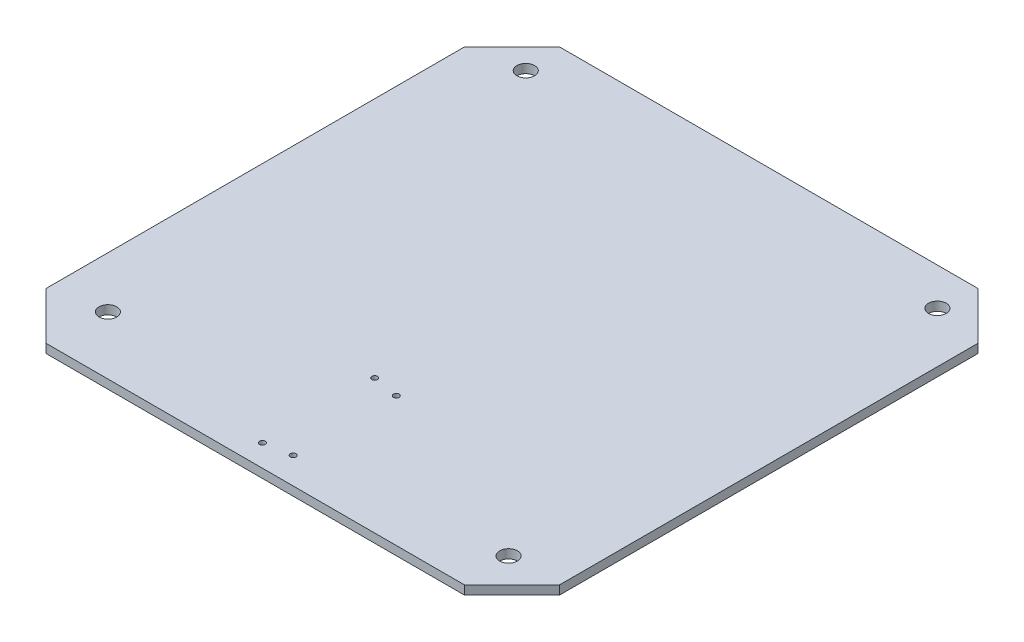
ISO-10303-21;
HEADER;
FILE_DESCRIPTION(('STEP AP214'),'2;1');
FILE_NAME('part.step','',(''),(''),'','','');
FILE_SCHEMA(('AUTOMOTIVE_DESIGN { 1 0 10303 214 1 1 1 1 }'));
ENDSEC;
DATA;
#1=APPLICATION_CONTEXT('core data for automotive mechanical design processes');
#2=APPLICATION_PROTOCOL_DEFINITION('international standard','automotive_design',2000,#1);
#3=PRODUCT_CONTEXT('',#1,'mechanical');
#4=PRODUCT('Part','Part','',(#3));
#5=PRODUCT_RELATED_PRODUCT_CATEGORY('part','',(#4));
#6=PRODUCT_DEFINITION_FORMATION('','',#4);
#7=PRODUCT_DEFINITION_CONTEXT('part definition',#1,'design');
#8=PRODUCT_DEFINITION('design','',#6,#7);
#9=PRODUCT_DEFINITION_SHAPE('','',#8);
#10=(LENGTH_UNIT() NAMED_UNIT(*) SI_UNIT(.MILLI.,.METRE.));
#11=(NAMED_UNIT(*) PLANE_ANGLE_UNIT() SI_UNIT($,.RADIAN.));
#12=(NAMED_UNIT(*) SI_UNIT($,.STERADIAN.) SOLID_ANGLE_UNIT());
#13=UNCERTAINTY_MEASURE_WITH_UNIT(LENGTH_MEASURE(1.E-05),#10,'distance_accuracy_value','');
#14=(GEOMETRIC_REPRESENTATION_CONTEXT(3) GLOBAL_UNCERTAINTY_ASSIGNED_CONTEXT((#13)) GLOBAL_UNIT_ASSIGNED_CONTEXT((#10,
#11,#12)) REPRESENTATION_CONTEXT('',''));
#15=CARTESIAN_POINT('',(0.,0.,0.));
#16=DIRECTION('',(0.,0.,1.));
#17=DIRECTION('',(1.,0.,0.));
#18=AXIS2_PLACEMENT_3D('',#15,#16,#17);
#19=CARTESIAN_POINT('',(0.,1.59,0.));
#20=DIRECTION('',(0.,-1.,0.));
#21=DIRECTION('',(0.,0.,-1.));
#22=AXIS2_PLACEMENT_3D('',#19,#20,#21);
#23=PLANE('',#22);
#24=CARTESIAN_POINT('',(-36.8206115379805,1.59,35.5891529581149));
#25=DIRECTION('',(0.,1.,0.));
#26=DIRECTION('',(0.,0.,1.));
#27=AXIS2_PLACEMENT_3D('',#24,#25,#26);
#28=CIRCLE('',#27,1.58999999999999);
#29=CARTESIAN_POINT('',(-36.8206115379805,1.59,37.1791529581149));
#30=VERTEX_POINT('',#29);
#31=EDGE_CURVE('E228',#30,#30,#28,.T.);
#32=ORIENTED_EDGE('',*,*,#31,.F.);
#33=EDGE_LOOP('',(#32));
#34=FACE_BOUND('',#33,.T.);
#35=CARTESIAN_POINT('',(36.9437573959671,1.59,-39.2835286977116));
#36=DIRECTION('',(0.,1.,0.));
#37=DIRECTION('',(0.,0.,1.));
#38=AXIS2_PLACEMENT_3D('',#35,#36,#37);
#39=CIRCLE('',#38,1.58999999999999);
#40=CARTESIAN_POINT('',(36.9437573959671,1.59,-37.6935286977116));
#41=VERTEX_POINT('',#40);
#42=EDGE_CURVE('E216',#41,#41,#39,.T.);
#43=ORIENTED_EDGE('',*,*,#42,.F.);
#44=EDGE_LOOP('',(#43));
#45=FACE_BOUND('',#44,.T.);
#46=DIRECTION('',(0.,0.,-1.));
#47=VECTOR('',#46,1.);
#48=CARTESIAN_POINT('',(46.,1.59,46.));
#49=LINE('',#48,#47);
#50=CARTESIAN_POINT('',(46.,1.59,37.5));
#51=VERTEX_POINT('',#50);
#52=CARTESIAN_POINT('',(46.,1.59,-37.4999999999999));
#53=VERTEX_POINT('',#52);
#54=EDGE_CURVE('E144',#51,#53,#49,.T.);
#55=ORIENTED_EDGE('',*,*,#54,.T.);
#56=DIRECTION('',(0.707106781186546,0.,0.707106781186549));
#57=VECTOR('',#56,1.);
#58=CARTESIAN_POINT('',(37.5,1.59,-46.));
#59=LINE('',#58,#57);
#60=CARTESIAN_POINT('',(37.5,1.59,-46.));
#61=VERTEX_POINT('',#60);
#62=EDGE_CURVE('E159',#53,#61,#59,.F.);
#63=ORIENTED_EDGE('',*,*,#62,.T.);
#64=DIRECTION('',(-1.,0.,0.));
#65=VECTOR('',#64,1.);
#66=CARTESIAN_POINT('',(-46.,1.59,-46.));
#67=LINE('',#66,#65);
#68=CARTESIAN_POINT('',(-37.5,1.59,-46.));
#69=VERTEX_POINT('',#68);
#70=EDGE_CURVE('E126',#61,#69,#67,.T.);
#71=ORIENTED_EDGE('',*,*,#70,.T.);
#72=DIRECTION('',(0.707106781186548,0.,-0.707106781186547));
#73=VECTOR('',#72,1.);
#74=CARTESIAN_POINT('',(-46.,1.59,-37.5));
#75=LINE('',#74,#73);
#76=CARTESIAN_POINT('',(-46.,1.59,-37.5));
#77=VERTEX_POINT('',#76);
#78=EDGE_CURVE('E157',#69,#77,#75,.F.);
#79=ORIENTED_EDGE('',*,*,#78,.T.);
#80=DIRECTION('',(0.,0.,1.));
#81=VECTOR('',#80,1.);
#82=CARTESIAN_POINT('',(-46.,1.59,46.));
#83=LINE('',#82,#81);
#84=CARTESIAN_POINT('',(-46.,1.59,37.5));
#85=VERTEX_POINT('',#84);
#86=EDGE_CURVE('E170',#77,#85,#83,.T.);
#87=ORIENTED_EDGE('',*,*,#86,.T.);
#88=DIRECTION('',(-0.707106781186546,0.,-0.707106781186549));
#89=VECTOR('',#88,1.);
#90=CARTESIAN_POINT('',(-37.5,1.59,46.));
#91=LINE('',#90,#89);
#92=CARTESIAN_POINT('',(-37.5,1.59,46.));
#93=VERTEX_POINT('',#92);
#94=EDGE_CURVE('E61',#85,#93,#91,.F.);
#95=ORIENTED_EDGE('',*,*,#94,.T.);
#96=DIRECTION('',(1.,0.,0.));
#97=VECTOR('',#96,1.);
#98=CARTESIAN_POINT('',(-46.,1.59,46.));
#99=LINE('',#98,#97);
#100=CARTESIAN_POINT('',(37.5,1.59,46.));
#101=VERTEX_POINT('',#100);
#102=EDGE_CURVE('E145',#93,#101,#99,.T.);
#103=ORIENTED_EDGE('',*,*,#102,.T.);
#104=DIRECTION('',(-0.707106781186549,0.,0.707106781186546));
#105=VECTOR('',#104,1.);
#106=CARTESIAN_POINT('',(46.,1.59,37.5));
#107=LINE('',#106,#105);
#108=EDGE_CURVE('E154',#101,#51,#107,.F.);
#109=ORIENTED_EDGE('',*,*,#108,.T.);
#110=EDGE_LOOP('',(#55,#63,#71,#79,#87,#95,#103,#109));
#111=FACE_BOUND('',#110,.T.);
#112=CARTESIAN_POINT('',(-2.67000000000001,1.59,21.93));
#113=DIRECTION('',(0.,1.,0.));
#114=DIRECTION('',(0.,0.,1.));
#115=AXIS2_PLACEMENT_3D('',#112,#113,#114);
#116=CIRCLE('',#115,0.509999999999999);
#117=CARTESIAN_POINT('',(-2.67000000000001,1.59,22.44));
#118=VERTEX_POINT('',#117);
#119=EDGE_CURVE('E139',#118,#118,#116,.T.);
#120=ORIENTED_EDGE('',*,*,#119,.F.);
#121=EDGE_LOOP('',(#120));
#122=FACE_BOUND('',#121,.T.);
#123=CARTESIAN_POINT('',(2.02999999999999,1.59,22.76));
#124=DIRECTION('',(0.,1.,0.));
#125=DIRECTION('',(0.,0.,1.));
#126=AXIS2_PLACEMENT_3D('',#123,#124,#125);
#127=CIRCLE('',#126,0.51);
#128=CARTESIAN_POINT('',(2.02999999999999,1.59,23.27));
#129=VERTEX_POINT('',#128);
#130=EDGE_CURVE('E187',#129,#129,#127,.T.);
#131=ORIENTED_EDGE('',*,*,#130,.F.);
#132=EDGE_LOOP('',(#131));
#133=FACE_BOUND('',#132,.T.);
#134=CARTESIAN_POINT('',(-2.67000000000001,1.59,42.06));
#135=DIRECTION('',(0.,1.,0.));
#136=DIRECTION('',(0.,0.,1.));
#137=AXIS2_PLACEMENT_3D('',#134,#135,#136);
#138=CIRCLE('',#137,0.510000000000002);
#139=CARTESIAN_POINT('',(-2.67000000000001,1.59,42.57));
#140=VERTEX_POINT('',#139);
#141=EDGE_CURVE('E193',#140,#140,#138,.T.);
#142=ORIENTED_EDGE('',*,*,#141,.F.);
#143=EDGE_LOOP('',(#142));
#144=FACE_BOUND('',#143,.T.);
#145=CARTESIAN_POINT('',(2.02999999999999,1.59,41.24));
#146=DIRECTION('',(0.,1.,0.));
#147=DIRECTION('',(0.,0.,1.));
#148=AXIS2_PLACEMENT_3D('',#145,#146,#147);
#149=CIRCLE('',#148,0.510000000000002);
#150=CARTESIAN_POINT('',(2.02999999999999,1.59,41.75));
#151=VERTEX_POINT('',#150);
#152=EDGE_CURVE('E199',#151,#151,#149,.T.);
#153=ORIENTED_EDGE('',*,*,#152,.F.);
#154=EDGE_LOOP('',(#153));
#155=FACE_BOUND('',#154,.T.);
#156=CARTESIAN_POINT('',(-36.8206115379805,1.59,-39.2835286977116));
#157=DIRECTION('',(0.,1.,0.));
#158=DIRECTION('',(0.,0.,1.));
#159=AXIS2_PLACEMENT_3D('',#156,#157,#158);
#160=CIRCLE('',#159,1.58999999999999);
#161=CARTESIAN_POINT('',(-36.8206115379805,1.59,-37.6935286977116));
#162=VERTEX_POINT('',#161);
#163=EDGE_CURVE('E210',#162,#162,#160,.T.);
#164=ORIENTED_EDGE('',*,*,#163,.F.);
#165=EDGE_LOOP('',(#164));
#166=FACE_BOUND('',#165,.T.);
#167=CARTESIAN_POINT('',(36.9437573959671,1.59,37.5594866858998));
#168=DIRECTION('',(0.,1.,0.));
#169=DIRECTION('',(0.,0.,1.));
#170=AXIS2_PLACEMENT_3D('',#167,#168,#169);
#171=CIRCLE('',#170,1.58999999999999);
#172=CARTESIAN_POINT('',(36.9437573959671,1.59,39.1494866858998));
#173=VERTEX_POINT('',#172);
#174=EDGE_CURVE('E222',#173,#173,#171,.T.);
#175=ORIENTED_EDGE('',*,*,#174,.F.);
#176=EDGE_LOOP('',(#175));
#177=FACE_BOUND('',#176,.T.);
#178=ADVANCED_FACE('F39',(#34,#45,#111,#122,#133,#144,#155,#166,#177),#23,.F.);
#179=CARTESIAN_POINT('',(0.,0.,0.));
#180=DIRECTION('',(0.,-1.,0.));
#181=DIRECTION('',(0.,0.,-1.));
#182=AXIS2_PLACEMENT_3D('',#179,#180,#181);
#183=PLANE('',#182);
#184=CARTESIAN_POINT('',(-36.8206115379805,0.,35.5891529581149));
#185=DIRECTION('',(0.,-1.,0.));
#186=DIRECTION('',(0.,0.,-1.));
#187=AXIS2_PLACEMENT_3D('',#184,#185,#186);
#188=CIRCLE('',#187,1.58999999999999);
#189=CARTESIAN_POINT('',(-36.8206115379805,0.,33.9991529581149));
#190=VERTEX_POINT('',#189);
#191=EDGE_CURVE('E225',#190,#190,#188,.T.);
#192=ORIENTED_EDGE('',*,*,#191,.F.);
#193=EDGE_LOOP('',(#192));
#194=FACE_BOUND('',#193,.T.);
#195=CARTESIAN_POINT('',(36.9437573959671,0.,37.5594866858998));
#196=DIRECTION('',(0.,-1.,0.));
#197=DIRECTION('',(0.,0.,-1.));
#198=AXIS2_PLACEMENT_3D('',#195,#196,#197);
#199=CIRCLE('',#198,1.58999999999999);
#200=CARTESIAN_POINT('',(36.9437573959671,0.,35.9694866858998));
#201=VERTEX_POINT('',#200);
#202=EDGE_CURVE('E219',#201,#201,#199,.T.);
#203=ORIENTED_EDGE('',*,*,#202,.F.);
#204=EDGE_LOOP('',(#203));
#205=FACE_BOUND('',#204,.T.);
#206=CARTESIAN_POINT('',(36.9437573959671,0.,-39.2835286977116));
#207=DIRECTION('',(0.,-1.,0.));
#208=DIRECTION('',(0.,0.,-1.));
#209=AXIS2_PLACEMENT_3D('',#206,#207,#208);
#210=CIRCLE('',#209,1.58999999999999);
#211=CARTESIAN_POINT('',(36.9437573959671,0.,-40.8735286977116));
#212=VERTEX_POINT('',#211);
#213=EDGE_CURVE('E213',#212,#212,#210,.T.);
#214=ORIENTED_EDGE('',*,*,#213,.F.);
#215=EDGE_LOOP('',(#214));
#216=FACE_BOUND('',#215,.T.);
#217=CARTESIAN_POINT('',(-36.8206115379805,0.,-39.2835286977116));
#218=DIRECTION('',(0.,-1.,0.));
#219=DIRECTION('',(0.,0.,-1.));
#220=AXIS2_PLACEMENT_3D('',#217,#218,#219);
#221=CIRCLE('',#220,1.58999999999999);
#222=CARTESIAN_POINT('',(-36.8206115379805,0.,-40.8735286977116));
#223=VERTEX_POINT('',#222);
#224=EDGE_CURVE('E205',#223,#223,#221,.T.);
#225=ORIENTED_EDGE('',*,*,#224,.F.);
#226=EDGE_LOOP('',(#225));
#227=FACE_BOUND('',#226,.T.);
#228=CARTESIAN_POINT('',(-2.67000000000001,0.,42.06));
#229=DIRECTION('',(0.,1.,0.));
#230=DIRECTION('',(0.,0.,1.));
#231=AXIS2_PLACEMENT_3D('',#228,#229,#230);
#232=CIRCLE('',#231,0.510000000000002);
#233=CARTESIAN_POINT('',(-2.67000000000001,0.,42.57));
#234=VERTEX_POINT('',#233);
#235=EDGE_CURVE('E196',#234,#234,#232,.T.);
#236=ORIENTED_EDGE('',*,*,#235,.T.);
#237=EDGE_LOOP('',(#236));
#238=FACE_BOUND('',#237,.T.);
#239=CARTESIAN_POINT('',(-2.67000000000001,0.,21.93));
#240=DIRECTION('',(0.,1.,0.));
#241=DIRECTION('',(0.,0.,1.));
#242=AXIS2_PLACEMENT_3D('',#239,#240,#241);
#243=CIRCLE('',#242,0.509999999999999);
#244=CARTESIAN_POINT('',(-2.67000000000001,0.,22.44));
#245=VERTEX_POINT('',#244);
#246=EDGE_CURVE('E184',#245,#245,#243,.T.);
#247=ORIENTED_EDGE('',*,*,#246,.T.);
#248=EDGE_LOOP('',(#247));
#249=FACE_BOUND('',#248,.T.);
#250=DIRECTION('',(-1.,0.,0.));
#251=VECTOR('',#250,1.);
#252=CARTESIAN_POINT('',(-46.,0.,-46.));
#253=LINE('',#252,#251);
#254=CARTESIAN_POINT('',(37.5,0.,-46.));
#255=VERTEX_POINT('',#254);
#256=CARTESIAN_POINT('',(-37.5,0.,-46.));
#257=VERTEX_POINT('',#256);
#258=EDGE_CURVE('E123',#255,#257,#253,.T.);
#259=ORIENTED_EDGE('',*,*,#258,.F.);
#260=DIRECTION('',(-0.707106781186546,0.,-0.707106781186549));
#261=VECTOR('',#260,1.);
#262=CARTESIAN_POINT('',(41.75,0.,-41.7499999999999));
#263=LINE('',#262,#261);
#264=CARTESIAN_POINT('',(46.,0.,-37.4999999999999));
#265=VERTEX_POINT('',#264);
#266=EDGE_CURVE('E106',#255,#265,#263,.F.);
#267=ORIENTED_EDGE('',*,*,#266,.T.);
#268=DIRECTION('',(0.,0.,-1.));
#269=VECTOR('',#268,1.);
#270=CARTESIAN_POINT('',(46.,0.,46.));
#271=LINE('',#270,#269);
#272=CARTESIAN_POINT('',(46.,0.,37.5));
#273=VERTEX_POINT('',#272);
#274=EDGE_CURVE('E134',#273,#265,#271,.T.);
#275=ORIENTED_EDGE('',*,*,#274,.F.);
#276=DIRECTION('',(0.707106781186549,0.,-0.707106781186546));
#277=VECTOR('',#276,1.);
#278=CARTESIAN_POINT('',(41.7499999999999,0.,41.7500000000001));
#279=LINE('',#278,#277);
#280=CARTESIAN_POINT('',(37.5,0.,46.));
#281=VERTEX_POINT('',#280);
#282=EDGE_CURVE('E127',#273,#281,#279,.F.);
#283=ORIENTED_EDGE('',*,*,#282,.T.);
#284=DIRECTION('',(1.,0.,0.));
#285=VECTOR('',#284,1.);
#286=CARTESIAN_POINT('',(-46.,0.,46.));
#287=LINE('',#286,#285);
#288=CARTESIAN_POINT('',(-37.5,0.,46.));
#289=VERTEX_POINT('',#288);
#290=EDGE_CURVE('E137',#289,#281,#287,.T.);
#291=ORIENTED_EDGE('',*,*,#290,.F.);
#292=DIRECTION('',(0.707106781186546,0.,0.707106781186549));
#293=VECTOR('',#292,1.);
#294=CARTESIAN_POINT('',(-41.7500000000001,0.,41.7499999999999));
#295=LINE('',#294,#293);
#296=CARTESIAN_POINT('',(-46.,0.,37.5));
#297=VERTEX_POINT('',#296);
#298=EDGE_CURVE('E148',#289,#297,#295,.F.);
#299=ORIENTED_EDGE('',*,*,#298,.T.);
#300=DIRECTION('',(0.,0.,1.));
#301=VECTOR('',#300,1.);
#302=CARTESIAN_POINT('',(-46.,0.,46.));
#303=LINE('',#302,#301);
#304=CARTESIAN_POINT('',(-46.,0.,-37.5));
#305=VERTEX_POINT('',#304);
#306=EDGE_CURVE('E133',#305,#297,#303,.T.);
#307=ORIENTED_EDGE('',*,*,#306,.F.);
#308=DIRECTION('',(-0.707106781186548,0.,0.707106781186547));
#309=VECTOR('',#308,1.);
#310=CARTESIAN_POINT('',(-41.75,0.,-41.75));
#311=LINE('',#310,#309);
#312=EDGE_CURVE('E117',#305,#257,#311,.F.);
#313=ORIENTED_EDGE('',*,*,#312,.T.);
#314=EDGE_LOOP('',(#259,#267,#275,#283,#291,#299,#307,#313));
#315=FACE_BOUND('',#314,.T.);
#316=CARTESIAN_POINT('',(2.02999999999999,0.,22.76));
#317=DIRECTION('',(0.,1.,0.));
#318=DIRECTION('',(0.,0.,1.));
#319=AXIS2_PLACEMENT_3D('',#316,#317,#318);
#320=CIRCLE('',#319,0.51);
#321=CARTESIAN_POINT('',(2.02999999999999,0.,23.27));
#322=VERTEX_POINT('',#321);
#323=EDGE_CURVE('E190',#322,#322,#320,.T.);
#324=ORIENTED_EDGE('',*,*,#323,.T.);
#325=EDGE_LOOP('',(#324));
#326=FACE_BOUND('',#325,.T.);
#327=CARTESIAN_POINT('',(2.02999999999999,0.,41.24));
#328=DIRECTION('',(0.,1.,0.));
#329=DIRECTION('',(0.,0.,1.));
#330=AXIS2_PLACEMENT_3D('',#327,#328,#329);
#331=CIRCLE('',#330,0.510000000000002);
#332=CARTESIAN_POINT('',(2.02999999999999,0.,41.75));
#333=VERTEX_POINT('',#332);
#334=EDGE_CURVE('E202',#333,#333,#331,.T.);
#335=ORIENTED_EDGE('',*,*,#334,.T.);
#336=EDGE_LOOP('',(#335));
#337=FACE_BOUND('',#336,.T.);
#338=ADVANCED_FACE('F130',(#194,#205,#216,#227,#238,#249,#315,#326,#337),#183,.T.);
#339=CARTESIAN_POINT('',(46.,1.59,46.));
#340=DIRECTION('',(-1.,0.,0.));
#341=DIRECTION('',(0.,0.,1.));
#342=AXIS2_PLACEMENT_3D('',#339,#340,#341);
#343=PLANE('',#342);
#344=ORIENTED_EDGE('',*,*,#274,.T.);
#345=DIRECTION('',(0.,1.,0.));
#346=VECTOR('',#345,1.);
#347=CARTESIAN_POINT('',(46.,1.59,-37.4999999999999));
#348=LINE('',#347,#346);
#349=EDGE_CURVE('E111',#265,#53,#348,.T.);
#350=ORIENTED_EDGE('',*,*,#349,.T.);
#351=ORIENTED_EDGE('',*,*,#54,.F.);
#352=DIRECTION('',(0.,-1.,0.));
#353=VECTOR('',#352,1.);
#354=CARTESIAN_POINT('',(46.,1.59,37.5));
#355=LINE('',#354,#353);
#356=EDGE_CURVE('E116',#51,#273,#355,.T.);
#357=ORIENTED_EDGE('',*,*,#356,.T.);
#358=EDGE_LOOP('',(#344,#350,#351,#357));
#359=FACE_BOUND('',#358,.T.);
#360=ADVANCED_FACE('F262',(#359),#343,.F.);
#361=CARTESIAN_POINT('',(-46.,1.59,-46.));
#362=DIRECTION('',(0.,0.,1.));
#363=DIRECTION('',(1.,0.,0.));
#364=AXIS2_PLACEMENT_3D('',#361,#362,#363);
#365=PLANE('',#364);
#366=ORIENTED_EDGE('',*,*,#70,.F.);
#367=DIRECTION('',(0.,-1.,0.));
#368=VECTOR('',#367,1.);
#369=CARTESIAN_POINT('',(37.5,1.59,-46.));
#370=LINE('',#369,#368);
#371=EDGE_CURVE('E110',#61,#255,#370,.T.);
#372=ORIENTED_EDGE('',*,*,#371,.T.);
#373=ORIENTED_EDGE('',*,*,#258,.T.);
#374=DIRECTION('',(0.,1.,0.));
#375=VECTOR('',#374,1.);
#376=CARTESIAN_POINT('',(-37.5,1.59,-46.));
#377=LINE('',#376,#375);
#378=EDGE_CURVE('E128',#257,#69,#377,.T.);
#379=ORIENTED_EDGE('',*,*,#378,.T.);
#380=EDGE_LOOP('',(#366,#372,#373,#379));
#381=FACE_BOUND('',#380,.T.);
#382=ADVANCED_FACE('F122',(#381),#365,.F.);
#383=CARTESIAN_POINT('',(-46.,1.59,46.));
#384=DIRECTION('',(1.,0.,0.));
#385=DIRECTION('',(0.,0.,-1.));
#386=AXIS2_PLACEMENT_3D('',#383,#384,#385);
#387=PLANE('',#386);
#388=ORIENTED_EDGE('',*,*,#86,.F.);
#389=DIRECTION('',(0.,-1.,0.));
#390=VECTOR('',#389,1.);
#391=CARTESIAN_POINT('',(-46.,1.59,-37.5));
#392=LINE('',#391,#390);
#393=EDGE_CURVE('E163',#77,#305,#392,.T.);
#394=ORIENTED_EDGE('',*,*,#393,.T.);
#395=ORIENTED_EDGE('',*,*,#306,.T.);
#396=DIRECTION('',(0.,1.,0.));
#397=VECTOR('',#396,1.);
#398=CARTESIAN_POINT('',(-46.,1.59,37.5));
#399=LINE('',#398,#397);
#400=EDGE_CURVE('E161',#297,#85,#399,.T.);
#401=ORIENTED_EDGE('',*,*,#400,.T.);
#402=EDGE_LOOP('',(#388,#394,#395,#401));
#403=FACE_BOUND('',#402,.T.);
#404=ADVANCED_FACE('F168',(#403),#387,.F.);
#405=CARTESIAN_POINT('',(-46.,1.59,46.));
#406=DIRECTION('',(0.,0.,-1.));
#407=DIRECTION('',(-1.,0.,0.));
#408=AXIS2_PLACEMENT_3D('',#405,#406,#407);
#409=PLANE('',#408);
#410=ORIENTED_EDGE('',*,*,#102,.F.);
#411=DIRECTION('',(0.,-1.,0.));
#412=VECTOR('',#411,1.);
#413=CARTESIAN_POINT('',(-37.5,1.59,46.));
#414=LINE('',#413,#412);
#415=EDGE_CURVE('E11',#93,#289,#414,.T.);
#416=ORIENTED_EDGE('',*,*,#415,.T.);
#417=ORIENTED_EDGE('',*,*,#290,.T.);
#418=DIRECTION('',(0.,1.,0.));
#419=VECTOR('',#418,1.);
#420=CARTESIAN_POINT('',(37.5,1.59,46.));
#421=LINE('',#420,#419);
#422=EDGE_CURVE('E48',#281,#101,#421,.T.);
#423=ORIENTED_EDGE('',*,*,#422,.T.);
#424=EDGE_LOOP('',(#410,#416,#417,#423));
#425=FACE_BOUND('',#424,.T.);
#426=ADVANCED_FACE('F177',(#425),#409,.F.);
#427=CARTESIAN_POINT('',(-2.67000000000001,1.59,21.93));
#428=DIRECTION('',(0.,-1.,0.));
#429=DIRECTION('',(0.,0.,-1.));
#430=AXIS2_PLACEMENT_3D('',#427,#428,#429);
#431=CYLINDRICAL_SURFACE('',#430,0.509999999999999);
#432=ORIENTED_EDGE('',*,*,#119,.T.);
#433=EDGE_LOOP('',(#432));
#434=FACE_BOUND('',#433,.T.);
#435=ORIENTED_EDGE('',*,*,#246,.F.);
#436=EDGE_LOOP('',(#435));
#437=FACE_BOUND('',#436,.T.);
#438=ADVANCED_FACE('F273',(#434,#437),#431,.F.);
#439=CARTESIAN_POINT('',(2.02999999999999,1.59,22.76));
#440=DIRECTION('',(0.,-1.,0.));
#441=DIRECTION('',(0.,0.,-1.));
#442=AXIS2_PLACEMENT_3D('',#439,#440,#441);
#443=CYLINDRICAL_SURFACE('',#442,0.51);
#444=ORIENTED_EDGE('',*,*,#130,.T.);
#445=EDGE_LOOP('',(#444));
#446=FACE_BOUND('',#445,.T.);
#447=ORIENTED_EDGE('',*,*,#323,.F.);
#448=EDGE_LOOP('',(#447));
#449=FACE_BOUND('',#448,.T.);
#450=ADVANCED_FACE('F275',(#446,#449),#443,.F.);
#451=CARTESIAN_POINT('',(-2.67000000000001,1.59,42.06));
#452=DIRECTION('',(0.,-1.,0.));
#453=DIRECTION('',(0.,0.,-1.));
#454=AXIS2_PLACEMENT_3D('',#451,#452,#453);
#455=CYLINDRICAL_SURFACE('',#454,0.510000000000002);
#456=ORIENTED_EDGE('',*,*,#141,.T.);
#457=EDGE_LOOP('',(#456));
#458=FACE_BOUND('',#457,.T.);
#459=ORIENTED_EDGE('',*,*,#235,.F.);
#460=EDGE_LOOP('',(#459));
#461=FACE_BOUND('',#460,.T.);
#462=ADVANCED_FACE('F282',(#458,#461),#455,.F.);
#463=CARTESIAN_POINT('',(2.02999999999999,1.59,41.24));
#464=DIRECTION('',(0.,-1.,0.));
#465=DIRECTION('',(0.,0.,-1.));
#466=AXIS2_PLACEMENT_3D('',#463,#464,#465);
#467=CYLINDRICAL_SURFACE('',#466,0.510000000000002);
#468=ORIENTED_EDGE('',*,*,#152,.T.);
#469=EDGE_LOOP('',(#468));
#470=FACE_BOUND('',#469,.T.);
#471=ORIENTED_EDGE('',*,*,#334,.F.);
#472=EDGE_LOOP('',(#471));
#473=FACE_BOUND('',#472,.T.);
#474=ADVANCED_FACE('F302',(#470,#473),#467,.F.);
#475=CARTESIAN_POINT('',(37.5,1.59,-46.));
#476=DIRECTION('',(-0.707106781186549,0.,0.707106781186546));
#477=DIRECTION('',(0.,-1.,0.));
#478=AXIS2_PLACEMENT_3D('',#475,#476,#477);
#479=PLANE('',#478);
#480=ORIENTED_EDGE('',*,*,#62,.F.);
#481=ORIENTED_EDGE('',*,*,#349,.F.);
#482=ORIENTED_EDGE('',*,*,#266,.F.);
#483=ORIENTED_EDGE('',*,*,#371,.F.);
#484=EDGE_LOOP('',(#480,#481,#482,#483));
#485=FACE_BOUND('',#484,.T.);
#486=ADVANCED_FACE('F109',(#485),#479,.F.);
#487=CARTESIAN_POINT('',(-46.,1.59,-37.5));
#488=DIRECTION('',(0.707106781186547,0.,0.707106781186548));
#489=DIRECTION('',(0.,-1.,0.));
#490=AXIS2_PLACEMENT_3D('',#487,#488,#489);
#491=PLANE('',#490);
#492=ORIENTED_EDGE('',*,*,#78,.F.);
#493=ORIENTED_EDGE('',*,*,#378,.F.);
#494=ORIENTED_EDGE('',*,*,#312,.F.);
#495=ORIENTED_EDGE('',*,*,#393,.F.);
#496=EDGE_LOOP('',(#492,#493,#494,#495));
#497=FACE_BOUND('',#496,.T.);
#498=ADVANCED_FACE('F301',(#497),#491,.F.);
#499=CARTESIAN_POINT('',(-37.5,1.59,46.));
#500=DIRECTION('',(0.707106781186549,0.,-0.707106781186546));
#501=DIRECTION('',(0.,-1.,0.));
#502=AXIS2_PLACEMENT_3D('',#499,#500,#501);
#503=PLANE('',#502);
#504=ORIENTED_EDGE('',*,*,#94,.F.);
#505=ORIENTED_EDGE('',*,*,#400,.F.);
#506=ORIENTED_EDGE('',*,*,#298,.F.);
#507=ORIENTED_EDGE('',*,*,#415,.F.);
#508=EDGE_LOOP('',(#504,#505,#506,#507));
#509=FACE_BOUND('',#508,.T.);
#510=ADVANCED_FACE('F176',(#509),#503,.F.);
#511=CARTESIAN_POINT('',(46.,1.59,37.5));
#512=DIRECTION('',(-0.707106781186546,0.,-0.707106781186549));
#513=DIRECTION('',(0.,-1.,0.));
#514=AXIS2_PLACEMENT_3D('',#511,#512,#513);
#515=PLANE('',#514);
#516=ORIENTED_EDGE('',*,*,#108,.F.);
#517=ORIENTED_EDGE('',*,*,#422,.F.);
#518=ORIENTED_EDGE('',*,*,#282,.F.);
#519=ORIENTED_EDGE('',*,*,#356,.F.);
#520=EDGE_LOOP('',(#516,#517,#518,#519));
#521=FACE_BOUND('',#520,.T.);
#522=ADVANCED_FACE('F42',(#521),#515,.F.);
#523=CARTESIAN_POINT('',(-36.8206115379805,1.59,-39.2835286977116));
#524=DIRECTION('',(0.,1.,0.));
#525=DIRECTION('',(0.,0.,1.));
#526=AXIS2_PLACEMENT_3D('',#523,#524,#525);
#527=CYLINDRICAL_SURFACE('',#526,1.58999999999999);
#528=ORIENTED_EDGE('',*,*,#163,.T.);
#529=EDGE_LOOP('',(#528));
#530=FACE_BOUND('',#529,.T.);
#531=ORIENTED_EDGE('',*,*,#224,.T.);
#532=EDGE_LOOP('',(#531));
#533=FACE_BOUND('',#532,.T.);
#534=ADVANCED_FACE('F313',(#530,#533),#527,.F.);
#535=CARTESIAN_POINT('',(36.9437573959671,1.59,-39.2835286977116));
#536=DIRECTION('',(0.,1.,0.));
#537=DIRECTION('',(0.,0.,1.));
#538=AXIS2_PLACEMENT_3D('',#535,#536,#537);
#539=CYLINDRICAL_SURFACE('',#538,1.58999999999999);
#540=ORIENTED_EDGE('',*,*,#42,.T.);
#541=EDGE_LOOP('',(#540));
#542=FACE_BOUND('',#541,.T.);
#543=ORIENTED_EDGE('',*,*,#213,.T.);
#544=EDGE_LOOP('',(#543));
#545=FACE_BOUND('',#544,.T.);
#546=ADVANCED_FACE('F256',(#542,#545),#539,.F.);
#547=CARTESIAN_POINT('',(36.9437573959671,1.59,37.5594866858998));
#548=DIRECTION('',(0.,1.,0.));
#549=DIRECTION('',(0.,0.,1.));
#550=AXIS2_PLACEMENT_3D('',#547,#548,#549);
#551=CYLINDRICAL_SURFACE('',#550,1.58999999999999);
#552=ORIENTED_EDGE('',*,*,#174,.T.);
#553=EDGE_LOOP('',(#552));
#554=FACE_BOUND('',#553,.T.);
#555=ORIENTED_EDGE('',*,*,#202,.T.);
#556=EDGE_LOOP('',(#555));
#557=FACE_BOUND('',#556,.T.);
#558=ADVANCED_FACE('F253',(#554,#557),#551,.F.);
#559=CARTESIAN_POINT('',(-36.8206115379805,1.59,35.5891529581149));
#560=DIRECTION('',(0.,1.,0.));
#561=DIRECTION('',(0.,0.,1.));
#562=AXIS2_PLACEMENT_3D('',#559,#560,#561);
#563=CYLINDRICAL_SURFACE('',#562,1.58999999999999);
#564=ORIENTED_EDGE('',*,*,#31,.T.);
#565=EDGE_LOOP('',(#564));
#566=FACE_BOUND('',#565,.T.);
#567=ORIENTED_EDGE('',*,*,#191,.T.);
#568=EDGE_LOOP('',(#567));
#569=FACE_BOUND('',#568,.T.);
#570=ADVANCED_FACE('F232',(#566,#569),#563,.F.);
#571=CLOSED_SHELL('',(#178,#338,#360,#382,#404,#426,#438,#450,#462,#474,#486,#498,#510,#522,
#534,#546,#558,#570));
#572=MANIFOLD_SOLID_BREP('B2',#571);
#573=ADVANCED_BREP_SHAPE_REPRESENTATION('',(#18,#572),#14);
#574=SHAPE_DEFINITION_REPRESENTATION(#9,#573);
ENDSEC;
END-ISO-10303-21;
